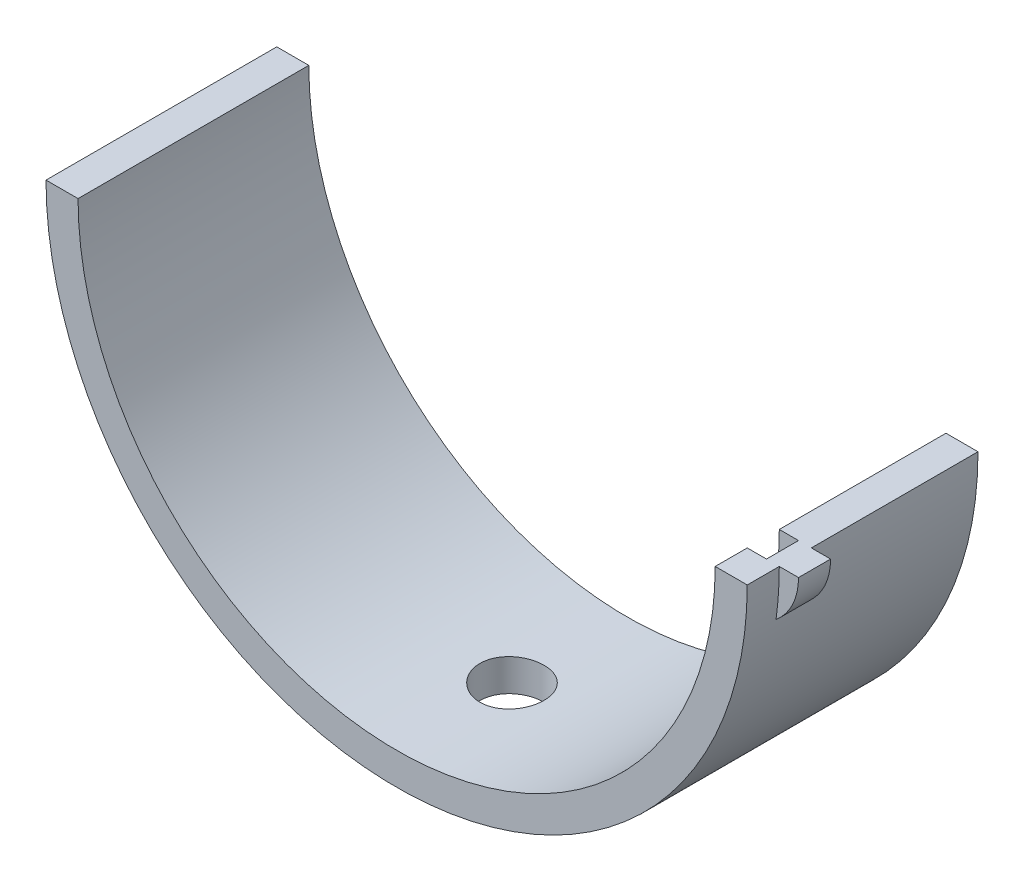
ISO-10303-21;
HEADER;
FILE_DESCRIPTION(('STEP AP214'),'2;1');
FILE_NAME('part.step','',(''),(''),'','','');
FILE_SCHEMA(('AUTOMOTIVE_DESIGN { 1 0 10303 214 1 1 1 1 }'));
ENDSEC;
DATA;
#1=APPLICATION_CONTEXT('core data for automotive mechanical design processes');
#2=APPLICATION_PROTOCOL_DEFINITION('international standard','automotive_design',2000,#1);
#3=PRODUCT_CONTEXT('',#1,'mechanical');
#4=PRODUCT('Part','Part','',(#3));
#5=PRODUCT_RELATED_PRODUCT_CATEGORY('part','',(#4));
#6=PRODUCT_DEFINITION_FORMATION('','',#4);
#7=PRODUCT_DEFINITION_CONTEXT('part definition',#1,'design');
#8=PRODUCT_DEFINITION('design','',#6,#7);
#9=PRODUCT_DEFINITION_SHAPE('','',#8);
#10=(LENGTH_UNIT() NAMED_UNIT(*) SI_UNIT(.MILLI.,.METRE.));
#11=(NAMED_UNIT(*) PLANE_ANGLE_UNIT() SI_UNIT($,.RADIAN.));
#12=(NAMED_UNIT(*) SI_UNIT($,.STERADIAN.) SOLID_ANGLE_UNIT());
#13=UNCERTAINTY_MEASURE_WITH_UNIT(LENGTH_MEASURE(1.E-05),#10,'distance_accuracy_value','');
#14=(GEOMETRIC_REPRESENTATION_CONTEXT(3) GLOBAL_UNCERTAINTY_ASSIGNED_CONTEXT((#13)) GLOBAL_UNIT_ASSIGNED_CONTEXT((#10,
#11,#12)) REPRESENTATION_CONTEXT('',''));
#15=CARTESIAN_POINT('',(0.,0.,0.));
#16=DIRECTION('',(0.,0.,1.));
#17=DIRECTION('',(1.,0.,0.));
#18=AXIS2_PLACEMENT_3D('',#15,#16,#17);
#19=CARTESIAN_POINT('',(0.,13.8938,-9.144));
#20=DIRECTION('',(0.,0.,1.));
#21=DIRECTION('',(1.,0.,0.));
#22=AXIS2_PLACEMENT_3D('',#19,#20,#21);
#23=CYLINDRICAL_SURFACE('',#22,13.8938);
#24=CARTESIAN_POINT('',(0.,13.8938,-2.54));
#25=DIRECTION('',(0.,0.,-1.));
#26=DIRECTION('',(-1.,0.,0.));
#27=AXIS2_PLACEMENT_3D('',#24,#25,#26);
#28=CIRCLE('',#27,13.8938);
#29=CARTESIAN_POINT('',(13.8938,13.8938,-2.54));
#30=VERTEX_POINT('',#29);
#31=CARTESIAN_POINT('',(13.7659716072745,12.0134531841939,-2.54));
#32=VERTEX_POINT('',#31);
#33=EDGE_CURVE('E60',#30,#32,#28,.T.);
#34=ORIENTED_EDGE('',*,*,#33,.T.);
#35=DIRECTION('',(0.,0.,1.));
#36=VECTOR('',#35,1.);
#37=CARTESIAN_POINT('',(13.7659716072745,12.0134531841939,-2.54));
#38=LINE('',#37,#36);
#39=CARTESIAN_POINT('',(13.7659716072745,12.0134531841939,-1.26999999999999));
#40=VERTEX_POINT('',#39);
#41=EDGE_CURVE('E149',#32,#40,#38,.T.);
#42=ORIENTED_EDGE('',*,*,#41,.T.);
#43=CARTESIAN_POINT('',(0.,13.8938,-1.26999999999999));
#44=DIRECTION('',(0.,0.,-1.));
#45=DIRECTION('',(-1.,0.,0.));
#46=AXIS2_PLACEMENT_3D('',#43,#44,#45);
#47=CIRCLE('',#46,13.8938);
#48=CARTESIAN_POINT('',(13.8938,13.8938,-1.26999999999999));
#49=VERTEX_POINT('',#48);
#50=EDGE_CURVE('E136',#49,#40,#47,.T.);
#51=ORIENTED_EDGE('',*,*,#50,.F.);
#52=DIRECTION('',(0.,0.,1.));
#53=VECTOR('',#52,1.);
#54=CARTESIAN_POINT('',(13.8938,13.8938,-9.144));
#55=LINE('',#54,#53);
#56=CARTESIAN_POINT('',(13.8938,13.8938,0.));
#57=VERTEX_POINT('',#56);
#58=EDGE_CURVE('E239',#49,#57,#55,.T.);
#59=ORIENTED_EDGE('',*,*,#58,.T.);
#60=CARTESIAN_POINT('',(0.,13.8938,0.));
#61=DIRECTION('',(0.,0.,1.));
#62=DIRECTION('',(-1.,0.,0.));
#63=AXIS2_PLACEMENT_3D('',#60,#61,#62);
#64=CIRCLE('',#63,13.8938);
#65=CARTESIAN_POINT('',(-13.8938,13.8938,0.));
#66=VERTEX_POINT('',#65);
#67=EDGE_CURVE('E214',#66,#57,#64,.T.);
#68=ORIENTED_EDGE('',*,*,#67,.F.);
#69=DIRECTION('',(0.,0.,1.));
#70=VECTOR('',#69,1.);
#71=CARTESIAN_POINT('',(-13.8938,13.8938,-9.144));
#72=LINE('',#71,#70);
#73=CARTESIAN_POINT('',(-13.8938,13.8938,-9.144));
#74=VERTEX_POINT('',#73);
#75=EDGE_CURVE('E11',#74,#66,#72,.T.);
#76=ORIENTED_EDGE('',*,*,#75,.F.);
#77=CARTESIAN_POINT('',(0.,13.8938,-9.144));
#78=DIRECTION('',(0.,0.,1.));
#79=DIRECTION('',(-1.,0.,0.));
#80=AXIS2_PLACEMENT_3D('',#77,#78,#79);
#81=CIRCLE('',#80,13.8938);
#82=CARTESIAN_POINT('',(13.8938,13.8938,-9.144));
#83=VERTEX_POINT('',#82);
#84=EDGE_CURVE('E231',#74,#83,#81,.T.);
#85=ORIENTED_EDGE('',*,*,#84,.T.);
#86=EDGE_CURVE('E39',#83,#30,#55,.T.);
#87=ORIENTED_EDGE('',*,*,#86,.T.);
#88=EDGE_LOOP('',(#34,#42,#51,#59,#68,#76,#85,#87));
#89=FACE_BOUND('',#88,.T.);
#90=CARTESIAN_POINT('',(0.,0.,-5.842));
#91=CARTESIAN_POINT('',(0.0711770961768593,7.55027293981269E-07,-5.84199690299967));
#92=CARTESIAN_POINT('',(0.142402002619507,0.000552775991494042,-5.83599618799228));
#93=CARTESIAN_POINT('',(0.282879326574018,0.00270181903745032,-5.81214753975789));
#94=CARTESIAN_POINT('',(0.352129447355612,0.00430000994585568,-5.7942863551752));
#95=CARTESIAN_POINT('',(0.486602453102687,0.00836088013479885,-5.74723920323498));
#96=CARTESIAN_POINT('',(0.551827662161192,0.0108230549298728,-5.71805984358336));
#97=CARTESIAN_POINT('',(0.676439564375869,0.0163361456518975,-5.64921693181494));
#98=CARTESIAN_POINT('',(0.735827462252079,0.0193869397112911,-5.60955554926557));
#99=CARTESIAN_POINT('',(0.847274102759627,0.0257455556359379,-5.52074489880028));
#100=CARTESIAN_POINT('',(0.89931266810868,0.0290540478404288,-5.47157035652335));
#101=CARTESIAN_POINT('',(0.994410186769628,0.0355495860558888,-5.36518294769229));
#102=CARTESIAN_POINT('',(1.03746873614764,0.038736626598522,-5.3079697197403));
#103=CARTESIAN_POINT('',(1.11345385492212,0.0446354326822346,-5.18700475161948));
#104=CARTESIAN_POINT('',(1.14636242590709,0.0473463503178557,-5.12324166071275));
#105=CARTESIAN_POINT('',(1.20099849001165,0.0519779630937575,-4.99106588353694));
#106=CARTESIAN_POINT('',(1.22272621686097,0.053898674752715,-4.92265329449705));
#107=CARTESIAN_POINT('',(1.25432463964175,0.0567265483451382,-4.78332454745656));
#108=CARTESIAN_POINT('',(1.26422851536764,0.0576365460157725,-4.71241597282458));
#109=CARTESIAN_POINT('',(1.27200063281985,0.0583488376043112,-4.5699375883627));
#110=CARTESIAN_POINT('',(1.26986914214814,0.058151156151057,-4.49836779327013));
#111=CARTESIAN_POINT('',(1.25365841829299,0.0566730086984938,-4.35682656805204));
#112=CARTESIAN_POINT('',(1.23961532202113,0.0553958177096661,-4.28685096016965));
#113=CARTESIAN_POINT('',(1.20003620107995,0.0519076843610036,-4.15025410716032));
#114=CARTESIAN_POINT('',(1.17450004422719,0.0496967312618452,-4.08363290062267));
#115=CARTESIAN_POINT('',(1.11261948384662,0.0445864213115756,-3.95552128391932));
#116=CARTESIAN_POINT('',(1.07625895065356,0.0416860384334915,-3.89403870730484));
#117=CARTESIAN_POINT('',(0.993773389362754,0.0355245764367408,-3.77803530566338));
#118=CARTESIAN_POINT('',(0.947648122803064,0.0322634885103212,-3.72351465070376));
#119=CARTESIAN_POINT('',(0.846740131796038,0.0257334753593184,-3.62277267505376));
#120=CARTESIAN_POINT('',(0.791926181340958,0.0224645654393562,-3.57658262505928));
#121=CARTESIAN_POINT('',(0.675305492153487,0.0162986124772205,-3.49405507753707));
#122=CARTESIAN_POINT('',(0.613498747402004,0.0134015697551385,-3.45771758849008));
#123=CARTESIAN_POINT('',(0.484625990960445,0.00830503893204529,-3.39592827752896));
#124=CARTESIAN_POINT('',(0.417559266611456,0.0061056455577998,-3.37047793370703));
#125=CARTESIAN_POINT('',(0.280080066996266,0.00265324972694275,-3.3312077212059));
#126=CARTESIAN_POINT('',(0.209667675340179,0.00140022363328658,-3.31738756204316));
#127=CARTESIAN_POINT('',(0.0677668263486781,-1.52219012188988E-05,-3.30180944313086));
#128=CARTESIAN_POINT('',(-0.00371685402281939,-0.000181544850942947,-3.30000830975542));
#129=CARTESIAN_POINT('',(-0.145969108141261,0.000584711187621375,-3.30840613405975));
#130=CARTESIAN_POINT('',(-0.216737689927421,0.00151727780818054,-3.31860495668298));
#131=CARTESIAN_POINT('',(-0.355427087218471,0.00437396927748449,-3.35067738627405));
#132=CARTESIAN_POINT('',(-0.423352590358522,0.00629638633065762,-3.37253088766111));
#133=CARTESIAN_POINT('',(-0.554573113356786,0.0109169566697305,-3.42727174052432));
#134=CARTESIAN_POINT('',(-0.617868045704571,0.0136151246113408,-3.46015930046106));
#135=CARTESIAN_POINT('',(-0.738226604720104,0.0194947680596447,-3.53614255053925));
#136=CARTESIAN_POINT('',(-0.795272177180583,0.0226775835147228,-3.57926673348353));
#137=CARTESIAN_POINT('',(-0.901330221543159,0.029164736842946,-3.67445807473798));
#138=CARTESIAN_POINT('',(-0.950342525329727,0.0324690772575227,-3.72652542015871));
#139=CARTESIAN_POINT('',(-1.03909168438775,0.0388385058567231,-3.83831291312128));
#140=CARTESIAN_POINT('',(-1.07880029118698,0.0419028470595456,-3.89805553590113));
#141=CARTESIAN_POINT('',(-1.14762095372816,0.0474343517121265,-4.02338630998318));
#142=CARTESIAN_POINT('',(-1.17673313352894,0.049901522153214,-4.08897439283783));
#143=CARTESIAN_POINT('',(-1.22348681656221,0.0539549098117844,-4.22403571378321));
#144=CARTESIAN_POINT('',(-1.24114538798737,0.055542437358177,-4.29350300249778));
#145=CARTESIAN_POINT('',(-1.26454607680511,0.0576610190416735,-4.43443175829216));
#146=CARTESIAN_POINT('',(-1.2702884749637,0.0581920980705511,-4.50589317834652));
#147=CARTESIAN_POINT('',(-1.26969027108677,0.058137209534714,-4.64850092813783));
#148=CARTESIAN_POINT('',(-1.26339404804715,0.0575553447070311,-4.71964744979997));
#149=CARTESIAN_POINT('',(-1.23899010391628,0.0553488606942045,-4.8598678266286));
#150=CARTESIAN_POINT('',(-1.22088236683148,0.0537242400971018,-4.92894167898842));
#151=CARTESIAN_POINT('',(-1.17338112562097,0.0496164039177988,-5.06305733558445));
#152=CARTESIAN_POINT('',(-1.14398865992742,0.0471332673391996,-5.12809951018028));
#153=CARTESIAN_POINT('',(-1.07475706010114,0.0415880333713149,-5.25233384016783));
#154=CARTESIAN_POINT('',(-1.03491804101358,0.0385259423580078,-5.31152605997371));
#155=CARTESIAN_POINT('',(-0.945757364645071,0.032154339125822,-5.4226075827347));
#156=CARTESIAN_POINT('',(-0.896402721701125,0.0288439914608479,-5.47447036177312));
#157=CARTESIAN_POINT('',(-0.789674677624653,0.0223565168850883,-5.56919882085483));
#158=CARTESIAN_POINT('',(-0.732299348351555,0.0191794222472498,-5.61206233129304));
#159=CARTESIAN_POINT('',(-0.61102638968786,0.0133095218167447,-5.68764543968937));
#160=CARTESIAN_POINT('',(-0.54711493322371,0.0106177774345528,-5.72034291595454));
#161=CARTESIAN_POINT('',(-0.414726630183913,0.00603383023774595,-5.77449966194138));
#162=CARTESIAN_POINT('',(-0.346255086072929,0.00414071694137324,-5.79597173593741));
#163=CARTESIAN_POINT('',(-0.231155847092363,0.00184857525822168,-5.82165235715952));
#164=CARTESIAN_POINT('',(-0.185266386848325,0.00115855067190865,-5.82927245096806));
#165=CARTESIAN_POINT('',(-0.0929247436255746,0.000234017312272208,-5.83944727504624));
#166=CARTESIAN_POINT('',(-0.0464725625093621,-4.92968302784853E-07,-5.84200202207661));
#167=CARTESIAN_POINT('',(0.,0.,-5.842));
#168=B_SPLINE_CURVE_WITH_KNOTS('',3,(#90,#91,#92,#93,#94,#95,#96,#97,#98,#99,#100,#101,#102,
#103,#104,#105,#106,#107,#108,#109,#110,#111,#112,#113,#114,#115,#116,#117,#118,#119,#120,#121,
#122,#123,#124,#125,#126,#127,#128,#129,#130,#131,#132,#133,#134,#135,#136,#137,#138,#139,#140,
#141,#142,#143,#144,#145,#146,#147,#148,#149,#150,#151,#152,#153,#154,#155,#156,#157,#158,#159,
#160,#161,#162,#163,#164,#165,#166,#167),.UNSPECIFIED.,.T.,.F.,(4,2,2,2,2,2,2,2,2,2,2,2,2,2,2,2,
2,2,2,2,2,2,2,2,2,2,2,2,2,2,2,2,2,2,2,2,2,2,4),(0.,0.213361601555118,0.426961987779502,
0.640437858407051,0.853869578390151,1.0678763259034,1.28189269766912,1.49628641978796,
1.71067565993545,1.92446186156589,2.13824330975694,2.35137850722454,2.56451615605548,
2.77797300991197,2.99143507714279,3.2056824591947,3.41993002566281,3.63420667020621,
3.84847796266884,4.06197915346865,4.27547794138852,4.48860960657508,4.70174529857142,
4.91548134020148,5.12922185420294,5.34360316572305,5.55798196726961,5.77204056256695,
5.98609411420986,6.19936010307214,6.41262638071099,6.62587303807283,6.83911734710328,
7.05311460275898,7.26716339123997,7.4816747501125,7.69594088941546,7.83524824680143,
7.97455514323242),.UNSPECIFIED.);
#169=CARTESIAN_POINT('',(0.,0.,-5.842));
#170=VERTEX_POINT('',#169);
#171=EDGE_CURVE('E159',#170,#170,#168,.T.);
#172=ORIENTED_EDGE('',*,*,#171,.F.);
#173=EDGE_LOOP('',(#172));
#174=FACE_BOUND('',#173,.T.);
#175=ADVANCED_FACE('F36',(#89,#174),#23,.T.);
#176=CARTESIAN_POINT('',(0.,13.8938,-9.144));
#177=DIRECTION('',(0.,0.,1.));
#178=DIRECTION('',(1.,0.,0.));
#179=AXIS2_PLACEMENT_3D('',#176,#177,#178);
#180=CYLINDRICAL_SURFACE('',#179,12.6238);
#181=CARTESIAN_POINT('',(0.,13.8938,-2.54));
#182=DIRECTION('',(0.,0.,-1.));
#183=DIRECTION('',(-1.,0.,0.));
#184=AXIS2_PLACEMENT_3D('',#181,#182,#183);
#185=CIRCLE('',#184,12.6238);
#186=CARTESIAN_POINT('',(12.6238,13.8938,-2.54));
#187=VERTEX_POINT('',#186);
#188=CARTESIAN_POINT('',(12.4829732953447,12.0134531841939,-2.54));
#189=VERTEX_POINT('',#188);
#190=EDGE_CURVE('E124',#187,#189,#185,.T.);
#191=ORIENTED_EDGE('',*,*,#190,.F.);
#192=DIRECTION('',(0.,0.,1.));
#193=VECTOR('',#192,1.);
#194=CARTESIAN_POINT('',(12.6238,13.8938,-9.144));
#195=LINE('',#194,#193);
#196=CARTESIAN_POINT('',(12.6238,13.8938,-9.144));
#197=VERTEX_POINT('',#196);
#198=EDGE_CURVE('E233',#197,#187,#195,.T.);
#199=ORIENTED_EDGE('',*,*,#198,.F.);
#200=CARTESIAN_POINT('',(0.,13.8938,-9.144));
#201=DIRECTION('',(0.,0.,-1.));
#202=DIRECTION('',(1.,0.,0.));
#203=AXIS2_PLACEMENT_3D('',#200,#201,#202);
#204=CIRCLE('',#203,12.6238);
#205=CARTESIAN_POINT('',(-12.6238,13.8938,-9.144));
#206=VERTEX_POINT('',#205);
#207=EDGE_CURVE('E243',#197,#206,#204,.T.);
#208=ORIENTED_EDGE('',*,*,#207,.T.);
#209=DIRECTION('',(0.,0.,1.));
#210=VECTOR('',#209,1.);
#211=CARTESIAN_POINT('',(-12.6238,13.8938,-9.144));
#212=LINE('',#211,#210);
#213=CARTESIAN_POINT('',(-12.6238,13.8938,0.));
#214=VERTEX_POINT('',#213);
#215=EDGE_CURVE('E44',#206,#214,#212,.T.);
#216=ORIENTED_EDGE('',*,*,#215,.T.);
#217=CARTESIAN_POINT('',(0.,13.8938,0.));
#218=DIRECTION('',(0.,0.,-1.));
#219=DIRECTION('',(1.,0.,0.));
#220=AXIS2_PLACEMENT_3D('',#217,#218,#219);
#221=CIRCLE('',#220,12.6238);
#222=CARTESIAN_POINT('',(12.6238,13.8938,0.));
#223=VERTEX_POINT('',#222);
#224=EDGE_CURVE('E222',#223,#214,#221,.T.);
#225=ORIENTED_EDGE('',*,*,#224,.F.);
#226=CARTESIAN_POINT('',(12.6238,13.8938,-1.26999999999999));
#227=VERTEX_POINT('',#226);
#228=EDGE_CURVE('E234',#227,#223,#195,.T.);
#229=ORIENTED_EDGE('',*,*,#228,.F.);
#230=CARTESIAN_POINT('',(0.,13.8938,-1.26999999999999));
#231=DIRECTION('',(0.,0.,-1.));
#232=DIRECTION('',(-1.,0.,0.));
#233=AXIS2_PLACEMENT_3D('',#230,#231,#232);
#234=CIRCLE('',#233,12.6238);
#235=CARTESIAN_POINT('',(12.4829732953447,12.0134531841939,-1.26999999999999));
#236=VERTEX_POINT('',#235);
#237=EDGE_CURVE('E52',#227,#236,#234,.T.);
#238=ORIENTED_EDGE('',*,*,#237,.T.);
#239=DIRECTION('',(0.,0.,1.));
#240=VECTOR('',#239,1.);
#241=CARTESIAN_POINT('',(12.4829732953447,12.0134531841939,-2.54));
#242=LINE('',#241,#240);
#243=EDGE_CURVE('E118',#189,#236,#242,.T.);
#244=ORIENTED_EDGE('',*,*,#243,.F.);
#245=EDGE_LOOP('',(#191,#199,#208,#216,#225,#229,#238,#244));
#246=FACE_BOUND('',#245,.T.);
#247=CARTESIAN_POINT('',(0.,1.27,-5.842));
#248=CARTESIAN_POINT('',(-0.0711435502847095,1.2700008232936,-5.84199692033279));
#249=CARTESIAN_POINT('',(-0.14233408139818,1.27060780186708,-5.83600183548226));
#250=CARTESIAN_POINT('',(-0.282741306942561,1.27297079295416,-5.81217685860484));
#251=CARTESIAN_POINT('',(-0.351955741688343,1.27472806992269,-5.79433394264771));
#252=CARTESIAN_POINT('',(-0.486357221148978,1.279193301369,-5.74733813262814));
#253=CARTESIAN_POINT('',(-0.551546676593216,1.28190068016626,-5.71819208617554));
#254=CARTESIAN_POINT('',(-0.676094044260609,1.28796341792548,-5.64943069215252));
#255=CARTESIAN_POINT('',(-0.735453109453916,1.29131864838282,-5.6098174202355));
#256=CARTESIAN_POINT('',(-0.84688495334552,1.29831492409751,-5.52109131093332));
#257=CARTESIAN_POINT('',(-0.898933530156923,1.30195685918112,-5.47194814551456));
#258=CARTESIAN_POINT('',(-0.994058910998386,1.30910872117233,-5.36562193504075));
#259=CARTESIAN_POINT('',(-1.03713529918087,1.31261864195509,-5.30843851753765));
#260=CARTESIAN_POINT('',(-1.11317930697364,1.31911816702836,-5.18750346232198));
#261=CARTESIAN_POINT('',(-1.14612501308779,1.32210663742682,-5.12373797922885));
#262=CARTESIAN_POINT('',(-1.20083252171333,1.32721386504191,-4.9915448476841));
#263=CARTESIAN_POINT('',(-1.22259460368948,1.32933264399078,-4.92311731577963));
#264=CARTESIAN_POINT('',(-1.25424534139919,1.33245255069079,-4.78378937790624));
#265=CARTESIAN_POINT('',(-1.2641741471714,1.33345745696994,-4.71289817874032));
#266=CARTESIAN_POINT('',(-1.27200060385572,1.3342475710726,-4.57044898580104));
#267=CARTESIAN_POINT('',(-1.26989857458944,1.33403281131908,-4.49889100980343));
#268=CARTESIAN_POINT('',(-1.25375612052799,1.33241130855729,-4.35741636520474));
#269=CARTESIAN_POINT('',(-1.23975954272493,1.33100894349626,-4.28749463636753));
#270=CARTESIAN_POINT('',(-1.20029353187321,1.32717708083241,-4.15099774981819));
#271=CARTESIAN_POINT('',(-1.17482394215218,1.32474756920319,-4.08442263782036));
#272=CARTESIAN_POINT('',(-1.11308652460165,1.31913012399075,-3.95637034939882));
#273=CARTESIAN_POINT('',(-1.07679925196909,1.31594082678312,-3.8949026100837));
#274=CARTESIAN_POINT('',(-0.9944705026778,1.30916431742947,-3.77891318257902));
#275=CARTESIAN_POINT('',(-0.948428737053473,1.30557709349682,-3.72439170024093));
#276=CARTESIAN_POINT('',(-0.847653103270119,1.29838941609435,-3.62358766462579));
#277=CARTESIAN_POINT('',(-0.792881369386651,1.29478897500996,-3.57734295707648));
#278=CARTESIAN_POINT('',(-0.676332029104487,1.28799565665298,-3.49469855161766));
#279=CARTESIAN_POINT('',(-0.614554414706111,1.28480277984579,-3.45829886494986));
#280=CARTESIAN_POINT('',(-0.485720668530063,1.27918327409951,-3.39637923953257));
#281=CARTESIAN_POINT('',(-0.418663602915753,1.27675678110157,-3.37086123069423));
#282=CARTESIAN_POINT('',(-0.28118686504237,1.27294483009888,-3.33145711058765));
#283=CARTESIAN_POINT('',(-0.210767294629982,1.27155934058449,-3.31757064724823));
#284=CARTESIAN_POINT('',(-0.0688922354922505,1.26998955411915,-3.3018718384635));
#285=CARTESIAN_POINT('',(0.00255741960815329,1.26980006190123,-3.30000727060255));
#286=CARTESIAN_POINT('',(0.14475221082111,1.27062968809255,-3.30826800601245));
#287=CARTESIAN_POINT('',(0.215497356555575,1.27164878997239,-3.31839314530552));
#288=CARTESIAN_POINT('',(0.354124132205051,1.27477776012733,-3.35030255406443));
#289=CARTESIAN_POINT('',(0.422011448715126,1.27688533961358,-3.37206236218525));
#290=CARTESIAN_POINT('',(0.553172281901728,1.28195483250738,-3.42659828250736));
#291=CARTESIAN_POINT('',(0.616445693911223,1.28491676528848,-3.45937464452607));
#292=CARTESIAN_POINT('',(0.736818669339548,1.29137661643764,-3.53514271508607));
#293=CARTESIAN_POINT('',(0.793896545936243,1.2948763201277,-3.57816872288486));
#294=CARTESIAN_POINT('',(0.900038670439808,1.30201330390525,-3.67316556898459));
#295=CARTESIAN_POINT('',(0.949102714670866,1.30565058748652,-3.72513663456));
#296=CARTESIAN_POINT('',(1.03800583416632,1.31266842468495,-3.83677623737469));
#297=CARTESIAN_POINT('',(1.07781062838375,1.31604799407313,-3.89647214459329));
#298=CARTESIAN_POINT('',(1.1468296461671,1.32215278020974,-4.02173193077151));
#299=CARTESIAN_POINT('',(1.17604401607072,1.32487800599965,-4.08729572863346));
#300=CARTESIAN_POINT('',(1.22299554802923,1.32935940723969,-4.22231276457704));
#301=CARTESIAN_POINT('',(1.24075308426449,1.33111730211224,-4.29175885819569));
#302=CARTESIAN_POINT('',(1.26435297326988,1.33347035044103,-4.43266559375158));
#303=CARTESIAN_POINT('',(1.27019567228003,1.33406553768503,-4.50412617708743));
#304=CARTESIAN_POINT('',(1.26979519454835,1.33402506902929,-4.64669264811147));
#305=CARTESIAN_POINT('',(1.26360586915809,1.33339489742627,-4.71779869475787));
#306=CARTESIAN_POINT('',(1.23942996963216,1.33098641233552,-4.85795539003117));
#307=CARTESIAN_POINT('',(1.22144338243965,1.32920809757707,-4.92700603638312));
#308=CARTESIAN_POINT('',(1.17419843253046,1.32470522387307,-5.06109128881293));
#309=CARTESIAN_POINT('',(1.14494167173226,1.32198079941097,-5.12612646411768));
#310=CARTESIAN_POINT('',(1.07599241872214,1.31589241213763,-5.25037171675574));
#311=CARTESIAN_POINT('',(1.03629998081018,1.31252845265412,-5.3095818243964));
#312=CARTESIAN_POINT('',(0.947403917983252,1.30552199653791,-5.42077215134744));
#313=CARTESIAN_POINT('',(0.898160164881389,1.30187836537515,-5.47272021772811));
#314=CARTESIAN_POINT('',(0.791638839163092,1.29473346259993,-5.56763927505905));
#315=CARTESIAN_POINT('',(0.734359345711614,1.29123222528367,-5.61060811351456));
#316=CARTESIAN_POINT('',(0.613232874352254,1.28475733471197,-5.68643513991203));
#317=CARTESIAN_POINT('',(0.549369554344869,1.28178504673584,-5.71926731982718));
#318=CARTESIAN_POINT('',(0.417047110230741,1.27671777099591,-5.77369816507563));
#319=CARTESIAN_POINT('',(0.348593262630672,1.27462179536578,-5.79530948636141));
#320=CARTESIAN_POINT('',(0.233127174566155,1.27206949352479,-5.82130099049868));
#321=CARTESIAN_POINT('',(0.186852837783259,1.27129705582731,-5.82905250152362));
#322=CARTESIAN_POINT('',(0.093725796965433,1.27026203891769,-5.83940301001203));
#323=CARTESIAN_POINT('',(0.0468730953526034,1.26999945757108,-5.84200202904598));
#324=CARTESIAN_POINT('',(0.,1.27,-5.842));
#325=B_SPLINE_CURVE_WITH_KNOTS('',3,(#247,#248,#249,#250,#251,#252,#253,#254,#255,#256,#257,
#258,#259,#260,#261,#262,#263,#264,#265,#266,#267,#268,#269,#270,#271,#272,#273,#274,#275,#276,
#277,#278,#279,#280,#281,#282,#283,#284,#285,#286,#287,#288,#289,#290,#291,#292,#293,#294,#295,
#296,#297,#298,#299,#300,#301,#302,#303,#304,#305,#306,#307,#308,#309,#310,#311,#312,#313,#314,
#315,#316,#317,#318,#319,#320,#321,#322,#323,#324),.UNSPECIFIED.,.T.,.F.,(4,2,2,2,2,2,2,2,2,2,2,
2,2,2,2,2,2,2,2,2,2,2,2,2,2,2,2,2,2,2,2,2,2,2,2,2,2,2,4),(0.,0.213259486738974,
0.426753791561727,0.640118959797176,0.853441849378183,1.0674551039395,1.28147827549015,
1.49596119191088,1.71043874841118,1.92418649663185,2.13792856271708,2.35088611015588,
2.5638465657739,2.77719215027337,2.99054405577338,3.20484789184597,3.41915197262433,
3.63349404533756,3.84782962997105,4.06123352239338,4.2746344962211,4.48758855863408,
4.70054745043615,4.91422925109336,5.1279164817424,5.34238269531245,5.5568459452914,
5.77092674706847,5.98500132766124,6.19811998701818,6.41123888224856,6.62432749638382,
6.83741500177739,7.05141794680079,7.26547213377182,7.48007104950306,7.69442739145238,
7.83493449385271,7.97544100803088),.UNSPECIFIED.);
#326=CARTESIAN_POINT('',(0.,1.27,-5.842));
#327=VERTEX_POINT('',#326);
#328=EDGE_CURVE('E168',#327,#327,#325,.T.);
#329=ORIENTED_EDGE('',*,*,#328,.F.);
#330=EDGE_LOOP('',(#329));
#331=FACE_BOUND('',#330,.T.);
#332=ADVANCED_FACE('F132',(#246,#331),#180,.F.);
#333=CARTESIAN_POINT('',(-13.8938,13.8938,-9.144));
#334=DIRECTION('',(0.,1.,0.));
#335=DIRECTION('',(-1.,0.,0.));
#336=AXIS2_PLACEMENT_3D('',#333,#334,#335);
#337=PLANE('',#336);
#338=DIRECTION('',(-1.,0.,0.));
#339=VECTOR('',#338,1.);
#340=CARTESIAN_POINT('',(-13.8938,13.8938,0.));
#341=LINE('',#340,#339);
#342=EDGE_CURVE('E230',#214,#66,#341,.T.);
#343=ORIENTED_EDGE('',*,*,#342,.F.);
#344=ORIENTED_EDGE('',*,*,#215,.F.);
#345=DIRECTION('',(-1.,0.,0.));
#346=VECTOR('',#345,1.);
#347=CARTESIAN_POINT('',(-13.8938,13.8938,-9.144));
#348=LINE('',#347,#346);
#349=EDGE_CURVE('E225',#206,#74,#348,.T.);
#350=ORIENTED_EDGE('',*,*,#349,.T.);
#351=ORIENTED_EDGE('',*,*,#75,.T.);
#352=EDGE_LOOP('',(#343,#344,#350,#351));
#353=FACE_BOUND('',#352,.T.);
#354=ADVANCED_FACE('F204',(#353),#337,.T.);
#355=CARTESIAN_POINT('',(13.8938,13.8938,-9.144));
#356=DIRECTION('',(0.,1.,0.));
#357=DIRECTION('',(-1.,0.,0.));
#358=AXIS2_PLACEMENT_3D('',#355,#356,#357);
#359=PLANE('',#358);
#360=DIRECTION('',(-1.,0.,0.));
#361=VECTOR('',#360,1.);
#362=CARTESIAN_POINT('',(13.3858,13.8938,-2.54));
#363=LINE('',#362,#361);
#364=CARTESIAN_POINT('',(13.3858,13.8938,-2.54));
#365=VERTEX_POINT('',#364);
#366=EDGE_CURVE('E123',#365,#187,#363,.T.);
#367=ORIENTED_EDGE('',*,*,#366,.F.);
#368=DIRECTION('',(0.,0.,1.));
#369=VECTOR('',#368,1.);
#370=CARTESIAN_POINT('',(13.3858,13.8938,-2.54));
#371=LINE('',#370,#369);
#372=CARTESIAN_POINT('',(13.3858,13.8938,-1.26999999999999));
#373=VERTEX_POINT('',#372);
#374=EDGE_CURVE('E120',#365,#373,#371,.T.);
#375=ORIENTED_EDGE('',*,*,#374,.T.);
#376=DIRECTION('',(-1.,0.,0.));
#377=VECTOR('',#376,1.);
#378=CARTESIAN_POINT('',(13.3858,13.8938,-1.26999999999999));
#379=LINE('',#378,#377);
#380=EDGE_CURVE('E130',#373,#227,#379,.T.);
#381=ORIENTED_EDGE('',*,*,#380,.T.);
#382=ORIENTED_EDGE('',*,*,#228,.T.);
#383=DIRECTION('',(-1.,0.,0.));
#384=VECTOR('',#383,1.);
#385=CARTESIAN_POINT('',(13.8938,13.8938,0.));
#386=LINE('',#385,#384);
#387=EDGE_CURVE('E216',#57,#223,#386,.T.);
#388=ORIENTED_EDGE('',*,*,#387,.F.);
#389=ORIENTED_EDGE('',*,*,#58,.F.);
#390=DIRECTION('',(-1.,0.,0.));
#391=VECTOR('',#390,1.);
#392=CARTESIAN_POINT('',(13.8938,13.8938,-1.26999999999999));
#393=LINE('',#392,#391);
#394=CARTESIAN_POINT('',(14.6558,13.8938,-1.26999999999999));
#395=VERTEX_POINT('',#394);
#396=EDGE_CURVE('E143',#395,#49,#393,.T.);
#397=ORIENTED_EDGE('',*,*,#396,.F.);
#398=DIRECTION('',(0.,0.,1.));
#399=VECTOR('',#398,1.);
#400=CARTESIAN_POINT('',(14.6558,13.8938,-2.54));
#401=LINE('',#400,#399);
#402=CARTESIAN_POINT('',(14.6558,13.8938,-2.54));
#403=VERTEX_POINT('',#402);
#404=EDGE_CURVE('E157',#403,#395,#401,.T.);
#405=ORIENTED_EDGE('',*,*,#404,.F.);
#406=DIRECTION('',(-1.,0.,0.));
#407=VECTOR('',#406,1.);
#408=CARTESIAN_POINT('',(13.8938,13.8938,-2.54));
#409=LINE('',#408,#407);
#410=EDGE_CURVE('E146',#403,#30,#409,.T.);
#411=ORIENTED_EDGE('',*,*,#410,.T.);
#412=ORIENTED_EDGE('',*,*,#86,.F.);
#413=DIRECTION('',(-1.,0.,0.));
#414=VECTOR('',#413,1.);
#415=CARTESIAN_POINT('',(13.8938,13.8938,-9.144));
#416=LINE('',#415,#414);
#417=EDGE_CURVE('E247',#83,#197,#416,.T.);
#418=ORIENTED_EDGE('',*,*,#417,.T.);
#419=ORIENTED_EDGE('',*,*,#198,.T.);
#420=EDGE_LOOP('',(#367,#375,#381,#382,#388,#389,#397,#405,#411,#412,#418,#419));
#421=FACE_BOUND('',#420,.T.);
#422=ADVANCED_FACE('F254',(#421),#359,.T.);
#423=CARTESIAN_POINT('',(0.,13.8938,-9.144));
#424=DIRECTION('',(0.,0.,-1.));
#425=DIRECTION('',(-1.,0.,0.));
#426=AXIS2_PLACEMENT_3D('',#423,#424,#425);
#427=PLANE('',#426);
#428=ORIENTED_EDGE('',*,*,#84,.F.);
#429=ORIENTED_EDGE('',*,*,#349,.F.);
#430=ORIENTED_EDGE('',*,*,#207,.F.);
#431=ORIENTED_EDGE('',*,*,#417,.F.);
#432=EDGE_LOOP('',(#428,#429,#430,#431));
#433=FACE_BOUND('',#432,.T.);
#434=ADVANCED_FACE('F253',(#433),#427,.T.);
#435=CARTESIAN_POINT('',(0.,13.8938,0.));
#436=DIRECTION('',(0.,0.,-1.));
#437=DIRECTION('',(-1.,0.,0.));
#438=AXIS2_PLACEMENT_3D('',#435,#436,#437);
#439=PLANE('',#438);
#440=ORIENTED_EDGE('',*,*,#67,.T.);
#441=ORIENTED_EDGE('',*,*,#387,.T.);
#442=ORIENTED_EDGE('',*,*,#224,.T.);
#443=ORIENTED_EDGE('',*,*,#342,.T.);
#444=EDGE_LOOP('',(#440,#441,#442,#443));
#445=FACE_BOUND('',#444,.T.);
#446=ADVANCED_FACE('F211',(#445),#439,.F.);
#447=CARTESIAN_POINT('',(0.,13.8948,-4.57199999999999));
#448=DIRECTION('',(0.,-1.,0.));
#449=DIRECTION('',(0.,0.,-1.));
#450=AXIS2_PLACEMENT_3D('',#447,#448,#449);
#451=CYLINDRICAL_SURFACE('',#450,1.27);
#452=ORIENTED_EDGE('',*,*,#171,.T.);
#453=EDGE_LOOP('',(#452));
#454=FACE_BOUND('',#453,.T.);
#455=ORIENTED_EDGE('',*,*,#328,.T.);
#456=EDGE_LOOP('',(#455));
#457=FACE_BOUND('',#456,.T.);
#458=ADVANCED_FACE('F174',(#454,#457),#451,.F.);
#459=CARTESIAN_POINT('',(12.2241520824967,13.8938,-2.54));
#460=DIRECTION('',(0.,0.,1.));
#461=DIRECTION('',(1.,0.,0.));
#462=AXIS2_PLACEMENT_3D('',#459,#460,#461);
#463=CYLINDRICAL_SURFACE('',#462,2.43164791750331);
#464=CARTESIAN_POINT('',(12.2241520824967,13.8938,-1.26999999999999));
#465=DIRECTION('',(0.,0.,1.));
#466=DIRECTION('',(1.,0.,0.));
#467=AXIS2_PLACEMENT_3D('',#464,#465,#466);
#468=CIRCLE('',#467,2.43164791750331);
#469=EDGE_CURVE('E152',#40,#395,#468,.T.);
#470=ORIENTED_EDGE('',*,*,#469,.F.);
#471=ORIENTED_EDGE('',*,*,#41,.F.);
#472=CARTESIAN_POINT('',(12.2241520824967,13.8938,-2.54));
#473=DIRECTION('',(0.,0.,1.));
#474=DIRECTION('',(1.,0.,0.));
#475=AXIS2_PLACEMENT_3D('',#472,#473,#474);
#476=CIRCLE('',#475,2.43164791750331);
#477=EDGE_CURVE('E142',#32,#403,#476,.T.);
#478=ORIENTED_EDGE('',*,*,#477,.T.);
#479=ORIENTED_EDGE('',*,*,#404,.T.);
#480=EDGE_LOOP('',(#470,#471,#478,#479));
#481=FACE_BOUND('',#480,.T.);
#482=ADVANCED_FACE('F180',(#481),#463,.T.);
#483=CARTESIAN_POINT('',(0.,13.8938,-2.54));
#484=DIRECTION('',(0.,0.,-1.));
#485=DIRECTION('',(-1.,0.,0.));
#486=AXIS2_PLACEMENT_3D('',#483,#484,#485);
#487=PLANE('',#486);
#488=ORIENTED_EDGE('',*,*,#33,.F.);
#489=ORIENTED_EDGE('',*,*,#410,.F.);
#490=ORIENTED_EDGE('',*,*,#477,.F.);
#491=EDGE_LOOP('',(#488,#489,#490));
#492=FACE_BOUND('',#491,.T.);
#493=ADVANCED_FACE('F183',(#492),#487,.T.);
#494=CARTESIAN_POINT('',(0.,13.8938,-1.26999999999999));
#495=DIRECTION('',(0.,0.,-1.));
#496=DIRECTION('',(-1.,0.,0.));
#497=AXIS2_PLACEMENT_3D('',#494,#495,#496);
#498=PLANE('',#497);
#499=ORIENTED_EDGE('',*,*,#50,.T.);
#500=ORIENTED_EDGE('',*,*,#469,.T.);
#501=ORIENTED_EDGE('',*,*,#396,.T.);
#502=EDGE_LOOP('',(#499,#500,#501));
#503=FACE_BOUND('',#502,.T.);
#504=ADVANCED_FACE('F185',(#503),#498,.F.);
#505=CARTESIAN_POINT('',(10.9762566269936,13.8938,-2.54));
#506=DIRECTION('',(0.,0.,1.));
#507=DIRECTION('',(1.,0.,0.));
#508=AXIS2_PLACEMENT_3D('',#505,#506,#507);
#509=CYLINDRICAL_SURFACE('',#508,2.40954337300637);
#510=CARTESIAN_POINT('',(10.9762566269936,13.8938,-1.26999999999999));
#511=DIRECTION('',(0.,0.,1.));
#512=DIRECTION('',(-1.,0.,0.));
#513=AXIS2_PLACEMENT_3D('',#510,#511,#512);
#514=CIRCLE('',#513,2.40954337300637);
#515=EDGE_CURVE('E351',#236,#373,#514,.T.);
#516=ORIENTED_EDGE('',*,*,#515,.T.);
#517=ORIENTED_EDGE('',*,*,#374,.F.);
#518=CARTESIAN_POINT('',(10.9762566269936,13.8938,-2.54));
#519=DIRECTION('',(0.,0.,1.));
#520=DIRECTION('',(-1.,0.,0.));
#521=AXIS2_PLACEMENT_3D('',#518,#519,#520);
#522=CIRCLE('',#521,2.40954337300637);
#523=EDGE_CURVE('E114',#189,#365,#522,.T.);
#524=ORIENTED_EDGE('',*,*,#523,.F.);
#525=ORIENTED_EDGE('',*,*,#243,.T.);
#526=EDGE_LOOP('',(#516,#517,#524,#525));
#527=FACE_BOUND('',#526,.T.);
#528=ADVANCED_FACE('F116',(#527),#509,.F.);
#529=CARTESIAN_POINT('',(0.,13.8938,-2.54));
#530=DIRECTION('',(0.,0.,-1.));
#531=DIRECTION('',(-1.,0.,0.));
#532=AXIS2_PLACEMENT_3D('',#529,#530,#531);
#533=PLANE('',#532);
#534=ORIENTED_EDGE('',*,*,#190,.T.);
#535=ORIENTED_EDGE('',*,*,#523,.T.);
#536=ORIENTED_EDGE('',*,*,#366,.T.);
#537=EDGE_LOOP('',(#534,#535,#536));
#538=FACE_BOUND('',#537,.T.);
#539=ADVANCED_FACE('F127',(#538),#533,.F.);
#540=CARTESIAN_POINT('',(0.,13.8938,-1.26999999999999));
#541=DIRECTION('',(0.,0.,-1.));
#542=DIRECTION('',(-1.,0.,0.));
#543=AXIS2_PLACEMENT_3D('',#540,#541,#542);
#544=PLANE('',#543);
#545=ORIENTED_EDGE('',*,*,#237,.F.);
#546=ORIENTED_EDGE('',*,*,#380,.F.);
#547=ORIENTED_EDGE('',*,*,#515,.F.);
#548=EDGE_LOOP('',(#545,#546,#547));
#549=FACE_BOUND('',#548,.T.);
#550=ADVANCED_FACE('F194',(#549),#544,.T.);
#551=CLOSED_SHELL('',(#175,#332,#354,#422,#434,#446,#458,#482,#493,#504,#528,#539,#550));
#552=MANIFOLD_SOLID_BREP('B2',#551);
#553=ADVANCED_BREP_SHAPE_REPRESENTATION('',(#18,#552),#14);
#554=SHAPE_DEFINITION_REPRESENTATION(#9,#553);
ENDSEC;
END-ISO-10303-21;
